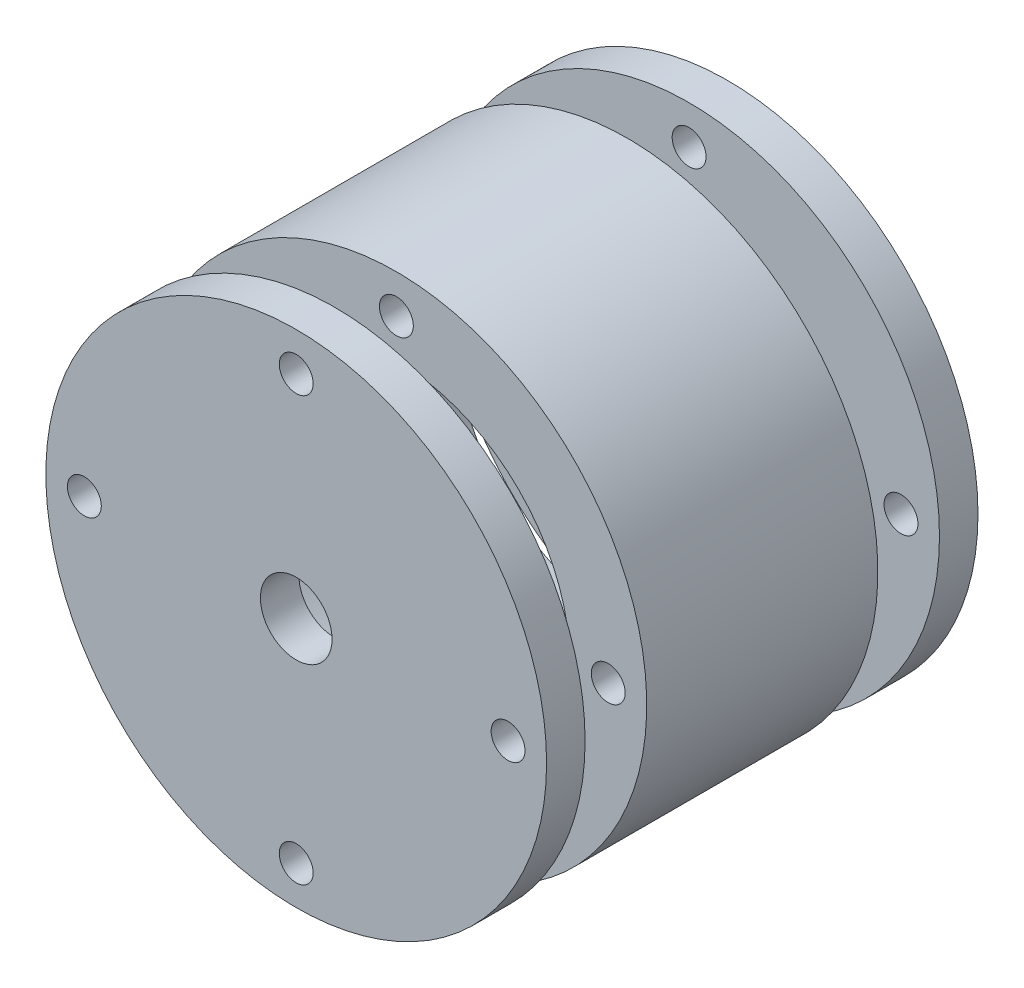
ISO-10303-21;
HEADER;
FILE_DESCRIPTION(('STEP AP214'),'2;1');
FILE_NAME('part.step','',(''),(''),'','','');
FILE_SCHEMA(('AUTOMOTIVE_DESIGN { 1 0 10303 214 1 1 1 1 }'));
ENDSEC;
DATA;
#1=APPLICATION_CONTEXT('core data for automotive mechanical design processes');
#2=APPLICATION_PROTOCOL_DEFINITION('international standard','automotive_design',2000,#1);
#3=PRODUCT_CONTEXT('',#1,'mechanical');
#4=PRODUCT('Part','Part','',(#3));
#5=PRODUCT_RELATED_PRODUCT_CATEGORY('part','',(#4));
#6=PRODUCT_DEFINITION_FORMATION('','',#4);
#7=PRODUCT_DEFINITION_CONTEXT('part definition',#1,'design');
#8=PRODUCT_DEFINITION('design','',#6,#7);
#9=PRODUCT_DEFINITION_SHAPE('','',#8);
#10=(LENGTH_UNIT() NAMED_UNIT(*) SI_UNIT(.MILLI.,.METRE.));
#11=(NAMED_UNIT(*) PLANE_ANGLE_UNIT() SI_UNIT($,.RADIAN.));
#12=(NAMED_UNIT(*) SI_UNIT($,.STERADIAN.) SOLID_ANGLE_UNIT());
#13=UNCERTAINTY_MEASURE_WITH_UNIT(LENGTH_MEASURE(1.E-05),#10,'distance_accuracy_value','');
#14=(GEOMETRIC_REPRESENTATION_CONTEXT(3) GLOBAL_UNCERTAINTY_ASSIGNED_CONTEXT((#13)) GLOBAL_UNIT_ASSIGNED_CONTEXT((#10,
#11,#12)) REPRESENTATION_CONTEXT('',''));
#15=CARTESIAN_POINT('',(0.,0.,0.));
#16=DIRECTION('',(0.,0.,1.));
#17=DIRECTION('',(1.,0.,0.));
#18=AXIS2_PLACEMENT_3D('',#15,#16,#17);
#19=CARTESIAN_POINT('',(0.,0.,-46.));
#20=DIRECTION('',(0.,0.,-1.));
#21=DIRECTION('',(1.,0.,0.));
#22=AXIS2_PLACEMENT_3D('',#19,#20,#21);
#23=PLANE('',#22);
#24=CARTESIAN_POINT('',(33.4966210299385,-33.7547722369169,-46.));
#25=DIRECTION('',(0.,0.,1.));
#26=DIRECTION('',(1.,0.,0.));
#27=AXIS2_PLACEMENT_3D('',#24,#25,#26);
#28=CIRCLE('',#27,4.65);
#29=CARTESIAN_POINT('',(38.1466210299385,-33.7547722369169,-46.));
#30=VERTEX_POINT('',#29);
#31=EDGE_CURVE('E74',#30,#30,#28,.T.);
#32=ORIENTED_EDGE('',*,*,#31,.F.);
#33=EDGE_LOOP('',(#32));
#34=FACE_BOUND('',#33,.T.);
#35=CARTESIAN_POINT('',(33.4966210299385,-33.7547722369169,-46.));
#36=DIRECTION('',(0.,0.,1.));
#37=DIRECTION('',(1.,0.,0.));
#38=AXIS2_PLACEMENT_3D('',#35,#36,#37);
#39=CIRCLE('',#38,15.6);
#40=CARTESIAN_POINT('',(49.0966210299385,-33.7547722369169,-46.));
#41=VERTEX_POINT('',#40);
#42=EDGE_CURVE('E117',#41,#41,#39,.T.);
#43=ORIENTED_EDGE('',*,*,#42,.T.);
#44=EDGE_LOOP('',(#43));
#45=FACE_BOUND('',#44,.T.);
#46=ADVANCED_FACE('F47',(#34,#45),#23,.F.);
#47=CARTESIAN_POINT('',(60.9966210299385,-33.7547722369169,-51.));
#48=DIRECTION('',(0.,0.,1.));
#49=DIRECTION('',(-1.,0.,0.));
#50=AXIS2_PLACEMENT_3D('',#47,#48,#49);
#51=CYLINDRICAL_SURFACE('',#50,2.2);
#52=CARTESIAN_POINT('',(60.9966210299385,-33.7547722369169,-51.));
#53=DIRECTION('',(0.,0.,1.));
#54=DIRECTION('',(1.,0.,0.));
#55=AXIS2_PLACEMENT_3D('',#52,#53,#54);
#56=CIRCLE('',#55,2.2);
#57=CARTESIAN_POINT('',(63.1966210299385,-33.7547722369169,-51.));
#58=VERTEX_POINT('',#57);
#59=EDGE_CURVE('E55',#58,#58,#56,.F.);
#60=ORIENTED_EDGE('',*,*,#59,.T.);
#61=EDGE_LOOP('',(#60));
#62=FACE_BOUND('',#61,.T.);
#63=CARTESIAN_POINT('',(60.9966210299385,-33.7547722369169,-46.));
#64=DIRECTION('',(0.,0.,1.));
#65=DIRECTION('',(1.,0.,0.));
#66=AXIS2_PLACEMENT_3D('',#63,#64,#65);
#67=CIRCLE('',#66,2.2);
#68=CARTESIAN_POINT('',(63.1966210299385,-33.7547722369169,-46.));
#69=VERTEX_POINT('',#68);
#70=EDGE_CURVE('E76',#69,#69,#67,.F.);
#71=ORIENTED_EDGE('',*,*,#70,.F.);
#72=EDGE_LOOP('',(#71));
#73=FACE_BOUND('',#72,.T.);
#74=ADVANCED_FACE('F107',(#62,#73),#51,.F.);
#75=CARTESIAN_POINT('',(33.4966210299385,-33.7547722369169,-51.));
#76=DIRECTION('',(0.,0.,1.));
#77=DIRECTION('',(-1.,0.,0.));
#78=AXIS2_PLACEMENT_3D('',#75,#76,#77);
#79=CYLINDRICAL_SURFACE('',#78,4.65);
#80=CARTESIAN_POINT('',(33.4966210299385,-33.7547722369169,-51.));
#81=DIRECTION('',(0.,0.,1.));
#82=DIRECTION('',(1.,0.,0.));
#83=AXIS2_PLACEMENT_3D('',#80,#81,#82);
#84=CIRCLE('',#83,4.65);
#85=CARTESIAN_POINT('',(38.1466210299385,-33.7547722369169,-51.));
#86=VERTEX_POINT('',#85);
#87=EDGE_CURVE('E60',#86,#86,#84,.T.);
#88=ORIENTED_EDGE('',*,*,#87,.F.);
#89=EDGE_LOOP('',(#88));
#90=FACE_BOUND('',#89,.T.);
#91=ORIENTED_EDGE('',*,*,#31,.T.);
#92=EDGE_LOOP('',(#91));
#93=FACE_BOUND('',#92,.T.);
#94=ADVANCED_FACE('F103',(#90,#93),#79,.F.);
#95=CARTESIAN_POINT('',(33.4966210299385,-61.2547722369169,-51.));
#96=DIRECTION('',(0.,0.,1.));
#97=DIRECTION('',(-1.,0.,0.));
#98=AXIS2_PLACEMENT_3D('',#95,#96,#97);
#99=CYLINDRICAL_SURFACE('',#98,2.2);
#100=CARTESIAN_POINT('',(33.4966210299385,-61.2547722369169,-51.));
#101=DIRECTION('',(0.,0.,1.));
#102=DIRECTION('',(1.,0.,0.));
#103=AXIS2_PLACEMENT_3D('',#100,#101,#102);
#104=CIRCLE('',#103,2.2);
#105=CARTESIAN_POINT('',(35.6966210299385,-61.2547722369169,-51.));
#106=VERTEX_POINT('',#105);
#107=EDGE_CURVE('E90',#106,#106,#104,.F.);
#108=ORIENTED_EDGE('',*,*,#107,.T.);
#109=EDGE_LOOP('',(#108));
#110=FACE_BOUND('',#109,.T.);
#111=CARTESIAN_POINT('',(33.4966210299385,-61.2547722369169,-46.));
#112=DIRECTION('',(0.,0.,1.));
#113=DIRECTION('',(1.,0.,0.));
#114=AXIS2_PLACEMENT_3D('',#111,#112,#113);
#115=CIRCLE('',#114,2.2);
#116=CARTESIAN_POINT('',(35.6966210299385,-61.2547722369169,-46.));
#117=VERTEX_POINT('',#116);
#118=EDGE_CURVE('E71',#117,#117,#115,.F.);
#119=ORIENTED_EDGE('',*,*,#118,.F.);
#120=EDGE_LOOP('',(#119));
#121=FACE_BOUND('',#120,.T.);
#122=ADVANCED_FACE('F106',(#110,#121),#99,.F.);
#123=CARTESIAN_POINT('',(5.9966210299385,-33.7547722369169,-51.));
#124=DIRECTION('',(0.,0.,1.));
#125=DIRECTION('',(-1.,0.,0.));
#126=AXIS2_PLACEMENT_3D('',#123,#124,#125);
#127=CYLINDRICAL_SURFACE('',#126,2.2);
#128=CARTESIAN_POINT('',(5.9966210299385,-33.7547722369169,-51.));
#129=DIRECTION('',(0.,0.,1.));
#130=DIRECTION('',(1.,0.,0.));
#131=AXIS2_PLACEMENT_3D('',#128,#129,#130);
#132=CIRCLE('',#131,2.2);
#133=CARTESIAN_POINT('',(8.1966210299385,-33.7547722369169,-51.));
#134=VERTEX_POINT('',#133);
#135=EDGE_CURVE('E85',#134,#134,#132,.F.);
#136=ORIENTED_EDGE('',*,*,#135,.T.);
#137=EDGE_LOOP('',(#136));
#138=FACE_BOUND('',#137,.T.);
#139=CARTESIAN_POINT('',(5.9966210299385,-33.7547722369169,-46.));
#140=DIRECTION('',(0.,0.,1.));
#141=DIRECTION('',(1.,0.,0.));
#142=AXIS2_PLACEMENT_3D('',#139,#140,#141);
#143=CIRCLE('',#142,2.2);
#144=CARTESIAN_POINT('',(8.1966210299385,-33.7547722369169,-46.));
#145=VERTEX_POINT('',#144);
#146=EDGE_CURVE('E67',#145,#145,#143,.F.);
#147=ORIENTED_EDGE('',*,*,#146,.F.);
#148=EDGE_LOOP('',(#147));
#149=FACE_BOUND('',#148,.T.);
#150=ADVANCED_FACE('F140',(#138,#149),#127,.F.);
#151=CARTESIAN_POINT('',(33.4966210299385,-6.25477223691686,-51.));
#152=DIRECTION('',(0.,0.,1.));
#153=DIRECTION('',(-1.,0.,0.));
#154=AXIS2_PLACEMENT_3D('',#151,#152,#153);
#155=CYLINDRICAL_SURFACE('',#154,2.2);
#156=CARTESIAN_POINT('',(33.4966210299385,-6.25477223691686,-51.));
#157=DIRECTION('',(0.,0.,1.));
#158=DIRECTION('',(1.,0.,0.));
#159=AXIS2_PLACEMENT_3D('',#156,#157,#158);
#160=CIRCLE('',#159,2.2);
#161=CARTESIAN_POINT('',(35.6966210299385,-6.25477223691686,-51.));
#162=VERTEX_POINT('',#161);
#163=EDGE_CURVE('E81',#162,#162,#160,.F.);
#164=ORIENTED_EDGE('',*,*,#163,.T.);
#165=EDGE_LOOP('',(#164));
#166=FACE_BOUND('',#165,.T.);
#167=CARTESIAN_POINT('',(33.4966210299385,-6.25477223691686,-46.));
#168=DIRECTION('',(0.,0.,1.));
#169=DIRECTION('',(1.,0.,0.));
#170=AXIS2_PLACEMENT_3D('',#167,#168,#169);
#171=CIRCLE('',#170,2.2);
#172=CARTESIAN_POINT('',(35.6966210299385,-6.25477223691686,-46.));
#173=VERTEX_POINT('',#172);
#174=EDGE_CURVE('E64',#173,#173,#171,.F.);
#175=ORIENTED_EDGE('',*,*,#174,.F.);
#176=EDGE_LOOP('',(#175));
#177=FACE_BOUND('',#176,.T.);
#178=ADVANCED_FACE('F49',(#166,#177),#155,.F.);
#179=CARTESIAN_POINT('',(33.4966210299385,-33.7547722369169,-51.));
#180=DIRECTION('',(0.,0.,1.));
#181=DIRECTION('',(-1.,0.,0.));
#182=AXIS2_PLACEMENT_3D('',#179,#180,#181);
#183=CYLINDRICAL_SURFACE('',#182,32.5);
#184=CARTESIAN_POINT('',(33.4966210299385,-33.7547722369169,-51.));
#185=DIRECTION('',(0.,0.,1.));
#186=DIRECTION('',(1.,0.,0.));
#187=AXIS2_PLACEMENT_3D('',#184,#185,#186);
#188=CIRCLE('',#187,32.5);
#189=CARTESIAN_POINT('',(65.9966210299385,-33.7547722369169,-51.));
#190=VERTEX_POINT('',#189);
#191=EDGE_CURVE('E13',#190,#190,#188,.T.);
#192=ORIENTED_EDGE('',*,*,#191,.T.);
#193=EDGE_LOOP('',(#192));
#194=FACE_BOUND('',#193,.T.);
#195=CARTESIAN_POINT('',(33.4966210299385,-33.7547722369169,-46.));
#196=DIRECTION('',(0.,0.,1.));
#197=DIRECTION('',(1.,0.,0.));
#198=AXIS2_PLACEMENT_3D('',#195,#196,#197);
#199=CIRCLE('',#198,32.5);
#200=CARTESIAN_POINT('',(65.9966210299385,-33.7547722369169,-46.));
#201=VERTEX_POINT('',#200);
#202=EDGE_CURVE('E51',#201,#201,#199,.T.);
#203=ORIENTED_EDGE('',*,*,#202,.F.);
#204=EDGE_LOOP('',(#203));
#205=FACE_BOUND('',#204,.T.);
#206=ADVANCED_FACE('F151',(#194,#205),#183,.T.);
#207=CARTESIAN_POINT('',(0.,0.,-51.));
#208=DIRECTION('',(0.,0.,-1.));
#209=DIRECTION('',(1.,0.,0.));
#210=AXIS2_PLACEMENT_3D('',#207,#208,#209);
#211=PLANE('',#210);
#212=ORIENTED_EDGE('',*,*,#163,.F.);
#213=EDGE_LOOP('',(#212));
#214=FACE_BOUND('',#213,.T.);
#215=ORIENTED_EDGE('',*,*,#135,.F.);
#216=EDGE_LOOP('',(#215));
#217=FACE_BOUND('',#216,.T.);
#218=ORIENTED_EDGE('',*,*,#107,.F.);
#219=EDGE_LOOP('',(#218));
#220=FACE_BOUND('',#219,.T.);
#221=ORIENTED_EDGE('',*,*,#87,.T.);
#222=EDGE_LOOP('',(#221));
#223=FACE_BOUND('',#222,.T.);
#224=ORIENTED_EDGE('',*,*,#59,.F.);
#225=EDGE_LOOP('',(#224));
#226=FACE_BOUND('',#225,.T.);
#227=ORIENTED_EDGE('',*,*,#191,.F.);
#228=EDGE_LOOP('',(#227));
#229=FACE_BOUND('',#228,.T.);
#230=ADVANCED_FACE('F100',(#214,#217,#220,#223,#226,#229),#211,.T.);
#231=CARTESIAN_POINT('',(33.4966210299385,-33.7547722369169,-46.));
#232=DIRECTION('',(0.,0.,1.));
#233=DIRECTION('',(1.,0.,0.));
#234=AXIS2_PLACEMENT_3D('',#231,#232,#233);
#235=CIRCLE('',#234,20.6);
#236=CARTESIAN_POINT('',(54.0966210299385,-33.7547722369169,-46.));
#237=VERTEX_POINT('',#236);
#238=EDGE_CURVE('E93',#237,#237,#235,.T.);
#239=ORIENTED_EDGE('',*,*,#238,.F.);
#240=EDGE_LOOP('',(#239));
#241=FACE_BOUND('',#240,.T.);
#242=ORIENTED_EDGE('',*,*,#174,.T.);
#243=EDGE_LOOP('',(#242));
#244=FACE_BOUND('',#243,.T.);
#245=ORIENTED_EDGE('',*,*,#146,.T.);
#246=EDGE_LOOP('',(#245));
#247=FACE_BOUND('',#246,.T.);
#248=ORIENTED_EDGE('',*,*,#118,.T.);
#249=EDGE_LOOP('',(#248));
#250=FACE_BOUND('',#249,.T.);
#251=ORIENTED_EDGE('',*,*,#70,.T.);
#252=EDGE_LOOP('',(#251));
#253=FACE_BOUND('',#252,.T.);
#254=ORIENTED_EDGE('',*,*,#202,.T.);
#255=EDGE_LOOP('',(#254));
#256=FACE_BOUND('',#255,.T.);
#257=ADVANCED_FACE('F114',(#241,#244,#247,#250,#253,#256),#23,.F.);
#258=CARTESIAN_POINT('',(33.4966210299385,-33.7547722369169,-48.5));
#259=DIRECTION('',(0.,0.,1.));
#260=DIRECTION('',(1.,0.,0.));
#261=AXIS2_PLACEMENT_3D('',#258,#259,#260);
#262=CYLINDRICAL_SURFACE('',#261,20.6);
#263=CARTESIAN_POINT('',(33.4966210299385,-33.7547722369169,-48.5));
#264=DIRECTION('',(0.,0.,1.));
#265=DIRECTION('',(1.,0.,0.));
#266=AXIS2_PLACEMENT_3D('',#263,#264,#265);
#267=CIRCLE('',#266,20.6);
#268=CARTESIAN_POINT('',(54.0966210299385,-33.7547722369169,-48.5));
#269=VERTEX_POINT('',#268);
#270=EDGE_CURVE('E68',#269,#269,#267,.T.);
#271=ORIENTED_EDGE('',*,*,#270,.F.);
#272=EDGE_LOOP('',(#271));
#273=FACE_BOUND('',#272,.T.);
#274=ORIENTED_EDGE('',*,*,#238,.T.);
#275=EDGE_LOOP('',(#274));
#276=FACE_BOUND('',#275,.T.);
#277=ADVANCED_FACE('F129',(#273,#276),#262,.F.);
#278=CARTESIAN_POINT('',(33.4966210299385,-33.7547722369169,-48.5));
#279=DIRECTION('',(0.,0.,1.));
#280=DIRECTION('',(1.,0.,0.));
#281=AXIS2_PLACEMENT_3D('',#278,#279,#280);
#282=PLANE('',#281);
#283=CARTESIAN_POINT('',(33.4966210299385,-33.7547722369169,-48.5));
#284=DIRECTION('',(0.,0.,1.));
#285=DIRECTION('',(1.,0.,0.));
#286=AXIS2_PLACEMENT_3D('',#283,#284,#285);
#287=CIRCLE('',#286,15.6);
#288=CARTESIAN_POINT('',(49.0966210299385,-33.7547722369169,-48.5));
#289=VERTEX_POINT('',#288);
#290=EDGE_CURVE('E119',#289,#289,#287,.T.);
#291=ORIENTED_EDGE('',*,*,#290,.F.);
#292=EDGE_LOOP('',(#291));
#293=FACE_BOUND('',#292,.T.);
#294=ORIENTED_EDGE('',*,*,#270,.T.);
#295=EDGE_LOOP('',(#294));
#296=FACE_BOUND('',#295,.T.);
#297=ADVANCED_FACE('F159',(#293,#296),#282,.T.);
#298=CARTESIAN_POINT('',(33.4966210299385,-33.7547722369169,-48.5));
#299=DIRECTION('',(0.,0.,1.));
#300=DIRECTION('',(1.,0.,0.));
#301=AXIS2_PLACEMENT_3D('',#298,#299,#300);
#302=CYLINDRICAL_SURFACE('',#301,15.6);
#303=ORIENTED_EDGE('',*,*,#290,.T.);
#304=EDGE_LOOP('',(#303));
#305=FACE_BOUND('',#304,.T.);
#306=ORIENTED_EDGE('',*,*,#42,.F.);
#307=EDGE_LOOP('',(#306));
#308=FACE_BOUND('',#307,.T.);
#309=ADVANCED_FACE('F163',(#305,#308),#302,.T.);
#310=CLOSED_SHELL('',(#46,#74,#94,#122,#150,#178,#206,#230,#257,#277,#297,#309));
#311=MANIFOLD_SOLID_BREP('B2',#310);
#312=CARTESIAN_POINT('',(33.4966210299385,-61.2547722369169,-38.));
#313=DIRECTION('',(0.,0.,1.));
#314=DIRECTION('',(1.,0.,0.));
#315=AXIS2_PLACEMENT_3D('',#312,#313,#314);
#316=CYLINDRICAL_SURFACE('',#315,2.2);
#317=CARTESIAN_POINT('',(33.4966210299385,-61.2547722369169,-38.));
#318=DIRECTION('',(0.,0.,-1.));
#319=DIRECTION('',(-1.,0.,0.));
#320=AXIS2_PLACEMENT_3D('',#317,#318,#319);
#321=CIRCLE('',#320,2.2);
#322=CARTESIAN_POINT('',(31.2966210299385,-61.2547722369169,-38.));
#323=VERTEX_POINT('',#322);
#324=EDGE_CURVE('E297',#323,#323,#321,.F.);
#325=ORIENTED_EDGE('',*,*,#324,.F.);
#326=EDGE_LOOP('',(#325));
#327=FACE_BOUND('',#326,.T.);
#328=CARTESIAN_POINT('',(33.4966210299385,-61.2547722369169,-8.));
#329=DIRECTION('',(0.,0.,-1.));
#330=DIRECTION('',(-1.,0.,0.));
#331=AXIS2_PLACEMENT_3D('',#328,#329,#330);
#332=CIRCLE('',#331,2.2);
#333=CARTESIAN_POINT('',(31.2966210299385,-61.2547722369169,-8.));
#334=VERTEX_POINT('',#333);
#335=EDGE_CURVE('E317',#334,#334,#332,.F.);
#336=ORIENTED_EDGE('',*,*,#335,.T.);
#337=EDGE_LOOP('',(#336));
#338=FACE_BOUND('',#337,.T.);
#339=ADVANCED_FACE('F289',(#327,#338),#316,.F.);
#340=CARTESIAN_POINT('',(60.9966210299385,-33.7547722369169,-38.));
#341=DIRECTION('',(0.,0.,1.));
#342=DIRECTION('',(1.,0.,0.));
#343=AXIS2_PLACEMENT_3D('',#340,#341,#342);
#344=CYLINDRICAL_SURFACE('',#343,2.2);
#345=CARTESIAN_POINT('',(60.9966210299385,-33.7547722369169,-38.));
#346=DIRECTION('',(0.,0.,-1.));
#347=DIRECTION('',(-1.,0.,0.));
#348=AXIS2_PLACEMENT_3D('',#345,#346,#347);
#349=CIRCLE('',#348,2.2);
#350=CARTESIAN_POINT('',(58.7966210299385,-33.7547722369169,-38.));
#351=VERTEX_POINT('',#350);
#352=EDGE_CURVE('E302',#351,#351,#349,.F.);
#353=ORIENTED_EDGE('',*,*,#352,.F.);
#354=EDGE_LOOP('',(#353));
#355=FACE_BOUND('',#354,.T.);
#356=CARTESIAN_POINT('',(60.9966210299385,-33.7547722369169,-8.));
#357=DIRECTION('',(0.,0.,-1.));
#358=DIRECTION('',(-1.,0.,0.));
#359=AXIS2_PLACEMENT_3D('',#356,#357,#358);
#360=CIRCLE('',#359,2.2);
#361=CARTESIAN_POINT('',(58.7966210299385,-33.7547722369169,-8.));
#362=VERTEX_POINT('',#361);
#363=EDGE_CURVE('E315',#362,#362,#360,.F.);
#364=ORIENTED_EDGE('',*,*,#363,.T.);
#365=EDGE_LOOP('',(#364));
#366=FACE_BOUND('',#365,.T.);
#367=ADVANCED_FACE('F341',(#355,#366),#344,.F.);
#368=CARTESIAN_POINT('',(5.9966210299385,-33.7547722369169,-38.));
#369=DIRECTION('',(0.,0.,1.));
#370=DIRECTION('',(1.,0.,0.));
#371=AXIS2_PLACEMENT_3D('',#368,#369,#370);
#372=CYLINDRICAL_SURFACE('',#371,2.2);
#373=CARTESIAN_POINT('',(5.9966210299385,-33.7547722369169,-38.));
#374=DIRECTION('',(0.,0.,-1.));
#375=DIRECTION('',(-1.,0.,0.));
#376=AXIS2_PLACEMENT_3D('',#373,#374,#375);
#377=CIRCLE('',#376,2.2);
#378=CARTESIAN_POINT('',(3.7966210299385,-33.7547722369169,-38.));
#379=VERTEX_POINT('',#378);
#380=EDGE_CURVE('E331',#379,#379,#377,.F.);
#381=ORIENTED_EDGE('',*,*,#380,.F.);
#382=EDGE_LOOP('',(#381));
#383=FACE_BOUND('',#382,.T.);
#384=CARTESIAN_POINT('',(5.9966210299385,-33.7547722369169,-8.));
#385=DIRECTION('',(0.,0.,-1.));
#386=DIRECTION('',(-1.,0.,0.));
#387=AXIS2_PLACEMENT_3D('',#384,#385,#386);
#388=CIRCLE('',#387,2.2);
#389=CARTESIAN_POINT('',(3.7966210299385,-33.7547722369169,-8.));
#390=VERTEX_POINT('',#389);
#391=EDGE_CURVE('E312',#390,#390,#388,.F.);
#392=ORIENTED_EDGE('',*,*,#391,.T.);
#393=EDGE_LOOP('',(#392));
#394=FACE_BOUND('',#393,.T.);
#395=ADVANCED_FACE('F344',(#383,#394),#372,.F.);
#396=CARTESIAN_POINT('',(33.4966210299385,-33.7547722369169,-38.));
#397=DIRECTION('',(0.,0.,1.));
#398=DIRECTION('',(1.,0.,0.));
#399=AXIS2_PLACEMENT_3D('',#396,#397,#398);
#400=CYLINDRICAL_SURFACE('',#399,32.5);
#401=CARTESIAN_POINT('',(33.4966210299385,-33.7547722369169,-38.));
#402=DIRECTION('',(0.,0.,-1.));
#403=DIRECTION('',(-1.,0.,0.));
#404=AXIS2_PLACEMENT_3D('',#401,#402,#403);
#405=CIRCLE('',#404,32.5);
#406=CARTESIAN_POINT('',(0.996621029938492,-33.7547722369169,-38.));
#407=VERTEX_POINT('',#406);
#408=EDGE_CURVE('E326',#407,#407,#405,.T.);
#409=ORIENTED_EDGE('',*,*,#408,.F.);
#410=EDGE_LOOP('',(#409));
#411=FACE_BOUND('',#410,.T.);
#412=CARTESIAN_POINT('',(33.4966210299385,-33.7547722369169,-8.));
#413=DIRECTION('',(0.,0.,-1.));
#414=DIRECTION('',(-1.,0.,0.));
#415=AXIS2_PLACEMENT_3D('',#412,#413,#414);
#416=CIRCLE('',#415,32.5);
#417=CARTESIAN_POINT('',(0.996621029938492,-33.7547722369169,-8.));
#418=VERTEX_POINT('',#417);
#419=EDGE_CURVE('E309',#418,#418,#416,.T.);
#420=ORIENTED_EDGE('',*,*,#419,.T.);
#421=EDGE_LOOP('',(#420));
#422=FACE_BOUND('',#421,.T.);
#423=ADVANCED_FACE('F370',(#411,#422),#400,.T.);
#424=CARTESIAN_POINT('',(33.4966210299385,-33.7547722369169,-38.));
#425=DIRECTION('',(0.,0.,1.));
#426=DIRECTION('',(1.,0.,0.));
#427=AXIS2_PLACEMENT_3D('',#424,#425,#426);
#428=CYLINDRICAL_SURFACE('',#427,22.5);
#429=CARTESIAN_POINT('',(33.4966210299385,-33.7547722369169,-38.));
#430=DIRECTION('',(0.,0.,-1.));
#431=DIRECTION('',(-1.,0.,0.));
#432=AXIS2_PLACEMENT_3D('',#429,#430,#431);
#433=CIRCLE('',#432,22.5);
#434=CARTESIAN_POINT('',(10.9966210299385,-33.7547722369169,-38.));
#435=VERTEX_POINT('',#434);
#436=EDGE_CURVE('E322',#435,#435,#433,.T.);
#437=ORIENTED_EDGE('',*,*,#436,.T.);
#438=EDGE_LOOP('',(#437));
#439=FACE_BOUND('',#438,.T.);
#440=CARTESIAN_POINT('',(33.4966210299385,-33.7547722369169,-8.));
#441=DIRECTION('',(0.,0.,-1.));
#442=DIRECTION('',(-1.,0.,0.));
#443=AXIS2_PLACEMENT_3D('',#440,#441,#442);
#444=CIRCLE('',#443,22.5);
#445=CARTESIAN_POINT('',(10.9966210299385,-33.7547722369169,-8.));
#446=VERTEX_POINT('',#445);
#447=EDGE_CURVE('E306',#446,#446,#444,.T.);
#448=ORIENTED_EDGE('',*,*,#447,.F.);
#449=EDGE_LOOP('',(#448));
#450=FACE_BOUND('',#449,.T.);
#451=ADVANCED_FACE('F291',(#439,#450),#428,.F.);
#452=CARTESIAN_POINT('',(33.4966210299385,-6.25477223691686,-38.));
#453=DIRECTION('',(0.,0.,1.));
#454=DIRECTION('',(1.,0.,0.));
#455=AXIS2_PLACEMENT_3D('',#452,#453,#454);
#456=CYLINDRICAL_SURFACE('',#455,2.2);
#457=CARTESIAN_POINT('',(33.4966210299385,-6.25477223691686,-38.));
#458=DIRECTION('',(0.,0.,-1.));
#459=DIRECTION('',(-1.,0.,0.));
#460=AXIS2_PLACEMENT_3D('',#457,#458,#459);
#461=CIRCLE('',#460,2.2);
#462=CARTESIAN_POINT('',(31.2966210299385,-6.25477223691686,-38.));
#463=VERTEX_POINT('',#462);
#464=EDGE_CURVE('E46',#463,#463,#461,.F.);
#465=ORIENTED_EDGE('',*,*,#464,.F.);
#466=EDGE_LOOP('',(#465));
#467=FACE_BOUND('',#466,.T.);
#468=CARTESIAN_POINT('',(33.4966210299385,-6.25477223691686,-8.));
#469=DIRECTION('',(0.,0.,-1.));
#470=DIRECTION('',(-1.,0.,0.));
#471=AXIS2_PLACEMENT_3D('',#468,#469,#470);
#472=CIRCLE('',#471,2.2);
#473=CARTESIAN_POINT('',(31.2966210299385,-6.25477223691686,-8.));
#474=VERTEX_POINT('',#473);
#475=EDGE_CURVE('E293',#474,#474,#472,.F.);
#476=ORIENTED_EDGE('',*,*,#475,.T.);
#477=EDGE_LOOP('',(#476));
#478=FACE_BOUND('',#477,.T.);
#479=ADVANCED_FACE('F357',(#467,#478),#456,.F.);
#480=CARTESIAN_POINT('',(0.,0.,-38.));
#481=DIRECTION('',(0.,0.,-1.));
#482=DIRECTION('',(-1.,0.,0.));
#483=AXIS2_PLACEMENT_3D('',#480,#481,#482);
#484=PLANE('',#483);
#485=ORIENTED_EDGE('',*,*,#436,.F.);
#486=EDGE_LOOP('',(#485));
#487=FACE_BOUND('',#486,.T.);
#488=ORIENTED_EDGE('',*,*,#408,.T.);
#489=EDGE_LOOP('',(#488));
#490=FACE_BOUND('',#489,.T.);
#491=ORIENTED_EDGE('',*,*,#380,.T.);
#492=EDGE_LOOP('',(#491));
#493=FACE_BOUND('',#492,.T.);
#494=ORIENTED_EDGE('',*,*,#352,.T.);
#495=EDGE_LOOP('',(#494));
#496=FACE_BOUND('',#495,.T.);
#497=ORIENTED_EDGE('',*,*,#324,.T.);
#498=EDGE_LOOP('',(#497));
#499=FACE_BOUND('',#498,.T.);
#500=ORIENTED_EDGE('',*,*,#464,.T.);
#501=EDGE_LOOP('',(#500));
#502=FACE_BOUND('',#501,.T.);
#503=ADVANCED_FACE('F338',(#487,#490,#493,#496,#499,#502),#484,.T.);
#504=CARTESIAN_POINT('',(0.,0.,-8.));
#505=DIRECTION('',(0.,0.,-1.));
#506=DIRECTION('',(-1.,0.,0.));
#507=AXIS2_PLACEMENT_3D('',#504,#505,#506);
#508=PLANE('',#507);
#509=ORIENTED_EDGE('',*,*,#447,.T.);
#510=EDGE_LOOP('',(#509));
#511=FACE_BOUND('',#510,.T.);
#512=ORIENTED_EDGE('',*,*,#419,.F.);
#513=EDGE_LOOP('',(#512));
#514=FACE_BOUND('',#513,.T.);
#515=ORIENTED_EDGE('',*,*,#391,.F.);
#516=EDGE_LOOP('',(#515));
#517=FACE_BOUND('',#516,.T.);
#518=ORIENTED_EDGE('',*,*,#363,.F.);
#519=EDGE_LOOP('',(#518));
#520=FACE_BOUND('',#519,.T.);
#521=ORIENTED_EDGE('',*,*,#335,.F.);
#522=EDGE_LOOP('',(#521));
#523=FACE_BOUND('',#522,.T.);
#524=ORIENTED_EDGE('',*,*,#475,.F.);
#525=EDGE_LOOP('',(#524));
#526=FACE_BOUND('',#525,.T.);
#527=ADVANCED_FACE('F348',(#511,#514,#517,#520,#523,#526),#508,.F.);
#528=CLOSED_SHELL('',(#339,#367,#395,#423,#451,#479,#503,#527));
#529=MANIFOLD_SOLID_BREP('B8_NOT_SHOWN',#528);
#530=CARTESIAN_POINT('',(0.,0.,0.));
#531=DIRECTION('',(0.,0.,1.));
#532=DIRECTION('',(1.,0.,0.));
#533=AXIS2_PLACEMENT_3D('',#530,#531,#532);
#534=PLANE('',#533);
#535=CARTESIAN_POINT('',(33.4966210299385,-33.7547722369169,0.));
#536=DIRECTION('',(0.,0.,1.));
#537=DIRECTION('',(1.,0.,0.));
#538=AXIS2_PLACEMENT_3D('',#535,#536,#537);
#539=CIRCLE('',#538,4.65);
#540=CARTESIAN_POINT('',(38.1466210299385,-33.7547722369169,0.));
#541=VERTEX_POINT('',#540);
#542=EDGE_CURVE('E476',#541,#541,#539,.T.);
#543=ORIENTED_EDGE('',*,*,#542,.T.);
#544=EDGE_LOOP('',(#543));
#545=FACE_BOUND('',#544,.T.);
#546=CARTESIAN_POINT('',(33.4966210299385,-33.7547722369169,0.));
#547=DIRECTION('',(0.,0.,1.));
#548=DIRECTION('',(1.,0.,0.));
#549=AXIS2_PLACEMENT_3D('',#546,#547,#548);
#550=CIRCLE('',#549,15.6);
#551=CARTESIAN_POINT('',(49.0966210299385,-33.7547722369169,0.));
#552=VERTEX_POINT('',#551);
#553=EDGE_CURVE('E454',#552,#552,#550,.F.);
#554=ORIENTED_EDGE('',*,*,#553,.T.);
#555=EDGE_LOOP('',(#554));
#556=FACE_BOUND('',#555,.T.);
#557=ADVANCED_FACE('F450',(#545,#556),#534,.F.);
#558=CARTESIAN_POINT('',(60.9966210299385,-33.7547722369169,5.));
#559=DIRECTION('',(0.,0.,-1.));
#560=DIRECTION('',(-1.,0.,0.));
#561=AXIS2_PLACEMENT_3D('',#558,#559,#560);
#562=CYLINDRICAL_SURFACE('',#561,2.2);
#563=CARTESIAN_POINT('',(60.9966210299385,-33.7547722369169,5.));
#564=DIRECTION('',(0.,0.,1.));
#565=DIRECTION('',(1.,0.,0.));
#566=AXIS2_PLACEMENT_3D('',#563,#564,#565);
#567=CIRCLE('',#566,2.2);
#568=CARTESIAN_POINT('',(63.1966210299385,-33.7547722369169,5.));
#569=VERTEX_POINT('',#568);
#570=EDGE_CURVE('E458',#569,#569,#567,.F.);
#571=ORIENTED_EDGE('',*,*,#570,.F.);
#572=EDGE_LOOP('',(#571));
#573=FACE_BOUND('',#572,.T.);
#574=CARTESIAN_POINT('',(60.9966210299385,-33.7547722369169,0.));
#575=DIRECTION('',(0.,0.,1.));
#576=DIRECTION('',(1.,0.,0.));
#577=AXIS2_PLACEMENT_3D('',#574,#575,#576);
#578=CIRCLE('',#577,2.2);
#579=CARTESIAN_POINT('',(63.1966210299385,-33.7547722369169,0.));
#580=VERTEX_POINT('',#579);
#581=EDGE_CURVE('E479',#580,#580,#578,.F.);
#582=ORIENTED_EDGE('',*,*,#581,.T.);
#583=EDGE_LOOP('',(#582));
#584=FACE_BOUND('',#583,.T.);
#585=ADVANCED_FACE('F521',(#573,#584),#562,.F.);
#586=CARTESIAN_POINT('',(33.4966210299385,-33.7547722369169,5.));
#587=DIRECTION('',(0.,0.,-1.));
#588=DIRECTION('',(-1.,0.,0.));
#589=AXIS2_PLACEMENT_3D('',#586,#587,#588);
#590=CYLINDRICAL_SURFACE('',#589,4.65);
#591=CARTESIAN_POINT('',(33.4966210299385,-33.7547722369169,5.));
#592=DIRECTION('',(0.,0.,1.));
#593=DIRECTION('',(1.,0.,0.));
#594=AXIS2_PLACEMENT_3D('',#591,#592,#593);
#595=CIRCLE('',#594,4.65);
#596=CARTESIAN_POINT('',(38.1466210299385,-33.7547722369169,5.));
#597=VERTEX_POINT('',#596);
#598=EDGE_CURVE('E463',#597,#597,#595,.T.);
#599=ORIENTED_EDGE('',*,*,#598,.T.);
#600=EDGE_LOOP('',(#599));
#601=FACE_BOUND('',#600,.T.);
#602=ORIENTED_EDGE('',*,*,#542,.F.);
#603=EDGE_LOOP('',(#602));
#604=FACE_BOUND('',#603,.T.);
#605=ADVANCED_FACE('F509',(#601,#604),#590,.F.);
#606=CARTESIAN_POINT('',(33.4966210299385,-61.2547722369169,5.));
#607=DIRECTION('',(0.,0.,-1.));
#608=DIRECTION('',(-1.,0.,0.));
#609=AXIS2_PLACEMENT_3D('',#606,#607,#608);
#610=CYLINDRICAL_SURFACE('',#609,2.2);
#611=CARTESIAN_POINT('',(33.4966210299385,-61.2547722369169,5.));
#612=DIRECTION('',(0.,0.,1.));
#613=DIRECTION('',(1.,0.,0.));
#614=AXIS2_PLACEMENT_3D('',#611,#612,#613);
#615=CIRCLE('',#614,2.2);
#616=CARTESIAN_POINT('',(35.6966210299385,-61.2547722369169,5.));
#617=VERTEX_POINT('',#616);
#618=EDGE_CURVE('E504',#617,#617,#615,.F.);
#619=ORIENTED_EDGE('',*,*,#618,.F.);
#620=EDGE_LOOP('',(#619));
#621=FACE_BOUND('',#620,.T.);
#622=CARTESIAN_POINT('',(33.4966210299385,-61.2547722369169,0.));
#623=DIRECTION('',(0.,0.,1.));
#624=DIRECTION('',(1.,0.,0.));
#625=AXIS2_PLACEMENT_3D('',#622,#623,#624);
#626=CIRCLE('',#625,2.2);
#627=CARTESIAN_POINT('',(35.6966210299385,-61.2547722369169,0.));
#628=VERTEX_POINT('',#627);
#629=EDGE_CURVE('E473',#628,#628,#626,.F.);
#630=ORIENTED_EDGE('',*,*,#629,.T.);
#631=EDGE_LOOP('',(#630));
#632=FACE_BOUND('',#631,.T.);
#633=ADVANCED_FACE('F625',(#621,#632),#610,.F.);
#634=CARTESIAN_POINT('',(5.9966210299385,-33.7547722369169,5.));
#635=DIRECTION('',(0.,0.,-1.));
#636=DIRECTION('',(-1.,0.,0.));
#637=AXIS2_PLACEMENT_3D('',#634,#635,#636);
#638=CYLINDRICAL_SURFACE('',#637,2.2);
#639=CARTESIAN_POINT('',(5.9966210299385,-33.7547722369169,5.));
#640=DIRECTION('',(0.,0.,1.));
#641=DIRECTION('',(1.,0.,0.));
#642=AXIS2_PLACEMENT_3D('',#639,#640,#641);
#643=CIRCLE('',#642,2.2);
#644=CARTESIAN_POINT('',(8.1966210299385,-33.7547722369169,5.));
#645=VERTEX_POINT('',#644);
#646=EDGE_CURVE('E501',#645,#645,#643,.F.);
#647=ORIENTED_EDGE('',*,*,#646,.F.);
#648=EDGE_LOOP('',(#647));
#649=FACE_BOUND('',#648,.T.);
#650=CARTESIAN_POINT('',(5.9966210299385,-33.7547722369169,0.));
#651=DIRECTION('',(0.,0.,1.));
#652=DIRECTION('',(1.,0.,0.));
#653=AXIS2_PLACEMENT_3D('',#650,#651,#652);
#654=CIRCLE('',#653,2.2);
#655=CARTESIAN_POINT('',(8.1966210299385,-33.7547722369169,0.));
#656=VERTEX_POINT('',#655);
#657=EDGE_CURVE('E470',#656,#656,#654,.F.);
#658=ORIENTED_EDGE('',*,*,#657,.T.);
#659=EDGE_LOOP('',(#658));
#660=FACE_BOUND('',#659,.T.);
#661=ADVANCED_FACE('F540',(#649,#660),#638,.F.);
#662=CARTESIAN_POINT('',(33.4966210299385,-6.25477223691686,5.));
#663=DIRECTION('',(0.,0.,-1.));
#664=DIRECTION('',(-1.,0.,0.));
#665=AXIS2_PLACEMENT_3D('',#662,#663,#664);
#666=CYLINDRICAL_SURFACE('',#665,2.2);
#667=CARTESIAN_POINT('',(33.4966210299385,-6.25477223691686,5.));
#668=DIRECTION('',(0.,0.,1.));
#669=DIRECTION('',(1.,0.,0.));
#670=AXIS2_PLACEMENT_3D('',#667,#668,#669);
#671=CIRCLE('',#670,2.2);
#672=CARTESIAN_POINT('',(35.6966210299385,-6.25477223691686,5.));
#673=VERTEX_POINT('',#672);
#674=EDGE_CURVE('E484',#673,#673,#671,.F.);
#675=ORIENTED_EDGE('',*,*,#674,.F.);
#676=EDGE_LOOP('',(#675));
#677=FACE_BOUND('',#676,.T.);
#678=CARTESIAN_POINT('',(33.4966210299385,-6.25477223691686,0.));
#679=DIRECTION('',(0.,0.,1.));
#680=DIRECTION('',(1.,0.,0.));
#681=AXIS2_PLACEMENT_3D('',#678,#679,#680);
#682=CIRCLE('',#681,2.2);
#683=CARTESIAN_POINT('',(35.6966210299385,-6.25477223691686,0.));
#684=VERTEX_POINT('',#683);
#685=EDGE_CURVE('E467',#684,#684,#682,.F.);
#686=ORIENTED_EDGE('',*,*,#685,.T.);
#687=EDGE_LOOP('',(#686));
#688=FACE_BOUND('',#687,.T.);
#689=ADVANCED_FACE('F452',(#677,#688),#666,.F.);
#690=CARTESIAN_POINT('',(33.4966210299385,-33.7547722369169,5.));
#691=DIRECTION('',(0.,0.,-1.));
#692=DIRECTION('',(-1.,0.,0.));
#693=AXIS2_PLACEMENT_3D('',#690,#691,#692);
#694=CYLINDRICAL_SURFACE('',#693,32.5);
#695=CARTESIAN_POINT('',(33.4966210299385,-33.7547722369169,5.));
#696=DIRECTION('',(0.,0.,1.));
#697=DIRECTION('',(1.,0.,0.));
#698=AXIS2_PLACEMENT_3D('',#695,#696,#697);
#699=CIRCLE('',#698,32.5);
#700=CARTESIAN_POINT('',(65.9966210299385,-33.7547722369169,5.));
#701=VERTEX_POINT('',#700);
#702=EDGE_CURVE('E288',#701,#701,#699,.T.);
#703=ORIENTED_EDGE('',*,*,#702,.F.);
#704=EDGE_LOOP('',(#703));
#705=FACE_BOUND('',#704,.T.);
#706=CARTESIAN_POINT('',(33.4966210299385,-33.7547722369169,0.));
#707=DIRECTION('',(0.,0.,1.));
#708=DIRECTION('',(1.,0.,0.));
#709=AXIS2_PLACEMENT_3D('',#706,#707,#708);
#710=CIRCLE('',#709,32.5);
#711=CARTESIAN_POINT('',(65.9966210299385,-33.7547722369169,0.));
#712=VERTEX_POINT('',#711);
#713=EDGE_CURVE('E482',#712,#712,#710,.T.);
#714=ORIENTED_EDGE('',*,*,#713,.T.);
#715=EDGE_LOOP('',(#714));
#716=FACE_BOUND('',#715,.T.);
#717=ADVANCED_FACE('F516',(#705,#716),#694,.T.);
#718=CARTESIAN_POINT('',(0.,0.,5.));
#719=DIRECTION('',(0.,0.,1.));
#720=DIRECTION('',(1.,0.,0.));
#721=AXIS2_PLACEMENT_3D('',#718,#719,#720);
#722=PLANE('',#721);
#723=ORIENTED_EDGE('',*,*,#674,.T.);
#724=EDGE_LOOP('',(#723));
#725=FACE_BOUND('',#724,.T.);
#726=ORIENTED_EDGE('',*,*,#646,.T.);
#727=EDGE_LOOP('',(#726));
#728=FACE_BOUND('',#727,.T.);
#729=ORIENTED_EDGE('',*,*,#618,.T.);
#730=EDGE_LOOP('',(#729));
#731=FACE_BOUND('',#730,.T.);
#732=ORIENTED_EDGE('',*,*,#598,.F.);
#733=EDGE_LOOP('',(#732));
#734=FACE_BOUND('',#733,.T.);
#735=ORIENTED_EDGE('',*,*,#570,.T.);
#736=EDGE_LOOP('',(#735));
#737=FACE_BOUND('',#736,.T.);
#738=ORIENTED_EDGE('',*,*,#702,.T.);
#739=EDGE_LOOP('',(#738));
#740=FACE_BOUND('',#739,.T.);
#741=ADVANCED_FACE('F512',(#725,#728,#731,#734,#737,#740),#722,.T.);
#742=CARTESIAN_POINT('',(33.4966210299385,-33.7547722369169,0.));
#743=DIRECTION('',(0.,0.,1.));
#744=DIRECTION('',(1.,0.,0.));
#745=AXIS2_PLACEMENT_3D('',#742,#743,#744);
#746=CIRCLE('',#745,20.6);
#747=CARTESIAN_POINT('',(54.0966210299385,-33.7547722369169,0.));
#748=VERTEX_POINT('',#747);
#749=EDGE_CURVE('E485',#748,#748,#746,.F.);
#750=ORIENTED_EDGE('',*,*,#749,.F.);
#751=EDGE_LOOP('',(#750));
#752=FACE_BOUND('',#751,.T.);
#753=ORIENTED_EDGE('',*,*,#685,.F.);
#754=EDGE_LOOP('',(#753));
#755=FACE_BOUND('',#754,.T.);
#756=ORIENTED_EDGE('',*,*,#657,.F.);
#757=EDGE_LOOP('',(#756));
#758=FACE_BOUND('',#757,.T.);
#759=ORIENTED_EDGE('',*,*,#629,.F.);
#760=EDGE_LOOP('',(#759));
#761=FACE_BOUND('',#760,.T.);
#762=ORIENTED_EDGE('',*,*,#581,.F.);
#763=EDGE_LOOP('',(#762));
#764=FACE_BOUND('',#763,.T.);
#765=ORIENTED_EDGE('',*,*,#713,.F.);
#766=EDGE_LOOP('',(#765));
#767=FACE_BOUND('',#766,.T.);
#768=ADVANCED_FACE('F515',(#752,#755,#758,#761,#764,#767),#534,.F.);
#769=CARTESIAN_POINT('',(33.4966210299385,-33.7547722369169,-109.265598769772));
#770=DIRECTION('',(0.,0.,1.));
#771=DIRECTION('',(1.,0.,0.));
#772=AXIS2_PLACEMENT_3D('',#769,#770,#771);
#773=CYLINDRICAL_SURFACE('',#772,15.6);
#774=CARTESIAN_POINT('',(33.4966210299385,-33.7547722369169,2.5));
#775=DIRECTION('',(0.,0.,-1.));
#776=DIRECTION('',(-1.,0.,0.));
#777=AXIS2_PLACEMENT_3D('',#774,#775,#776);
#778=CIRCLE('',#777,15.6);
#779=CARTESIAN_POINT('',(17.8966210299385,-33.7547722369169,2.5));
#780=VERTEX_POINT('',#779);
#781=EDGE_CURVE('E492',#780,#780,#778,.T.);
#782=ORIENTED_EDGE('',*,*,#781,.T.);
#783=EDGE_LOOP('',(#782));
#784=FACE_BOUND('',#783,.T.);
#785=ORIENTED_EDGE('',*,*,#553,.F.);
#786=EDGE_LOOP('',(#785));
#787=FACE_BOUND('',#786,.T.);
#788=ADVANCED_FACE('F529',(#784,#787),#773,.T.);
#789=CARTESIAN_POINT('',(33.4966210299385,-33.7547722369169,-109.265598769772));
#790=DIRECTION('',(0.,0.,1.));
#791=DIRECTION('',(1.,0.,0.));
#792=AXIS2_PLACEMENT_3D('',#789,#790,#791);
#793=CYLINDRICAL_SURFACE('',#792,20.6);
#794=CARTESIAN_POINT('',(33.4966210299385,-33.7547722369169,2.5));
#795=DIRECTION('',(0.,0.,-1.));
#796=DIRECTION('',(-1.,0.,0.));
#797=AXIS2_PLACEMENT_3D('',#794,#795,#796);
#798=CIRCLE('',#797,20.6);
#799=CARTESIAN_POINT('',(12.8966210299385,-33.7547722369169,2.5));
#800=VERTEX_POINT('',#799);
#801=EDGE_CURVE('E487',#800,#800,#798,.T.);
#802=ORIENTED_EDGE('',*,*,#801,.F.);
#803=EDGE_LOOP('',(#802));
#804=FACE_BOUND('',#803,.T.);
#805=ORIENTED_EDGE('',*,*,#749,.T.);
#806=EDGE_LOOP('',(#805));
#807=FACE_BOUND('',#806,.T.);
#808=ADVANCED_FACE('F548',(#804,#807),#793,.F.);
#809=CARTESIAN_POINT('',(0.,0.,2.5));
#810=DIRECTION('',(0.,0.,-1.));
#811=DIRECTION('',(-1.,0.,0.));
#812=AXIS2_PLACEMENT_3D('',#809,#810,#811);
#813=PLANE('',#812);
#814=ORIENTED_EDGE('',*,*,#781,.F.);
#815=EDGE_LOOP('',(#814));
#816=FACE_BOUND('',#815,.T.);
#817=ORIENTED_EDGE('',*,*,#801,.T.);
#818=EDGE_LOOP('',(#817));
#819=FACE_BOUND('',#818,.T.);
#820=ADVANCED_FACE('F551',(#816,#819),#813,.T.);
#821=CLOSED_SHELL('',(#557,#585,#605,#633,#661,#689,#717,#741,#768,#788,#808,#820));
#822=MANIFOLD_SOLID_BREP('B41',#821);
#823=ADVANCED_BREP_SHAPE_REPRESENTATION('',(#18,#311,#529,#822),#14);
#824=SHAPE_DEFINITION_REPRESENTATION(#9,#823);
ENDSEC;
END-ISO-10303-21;
